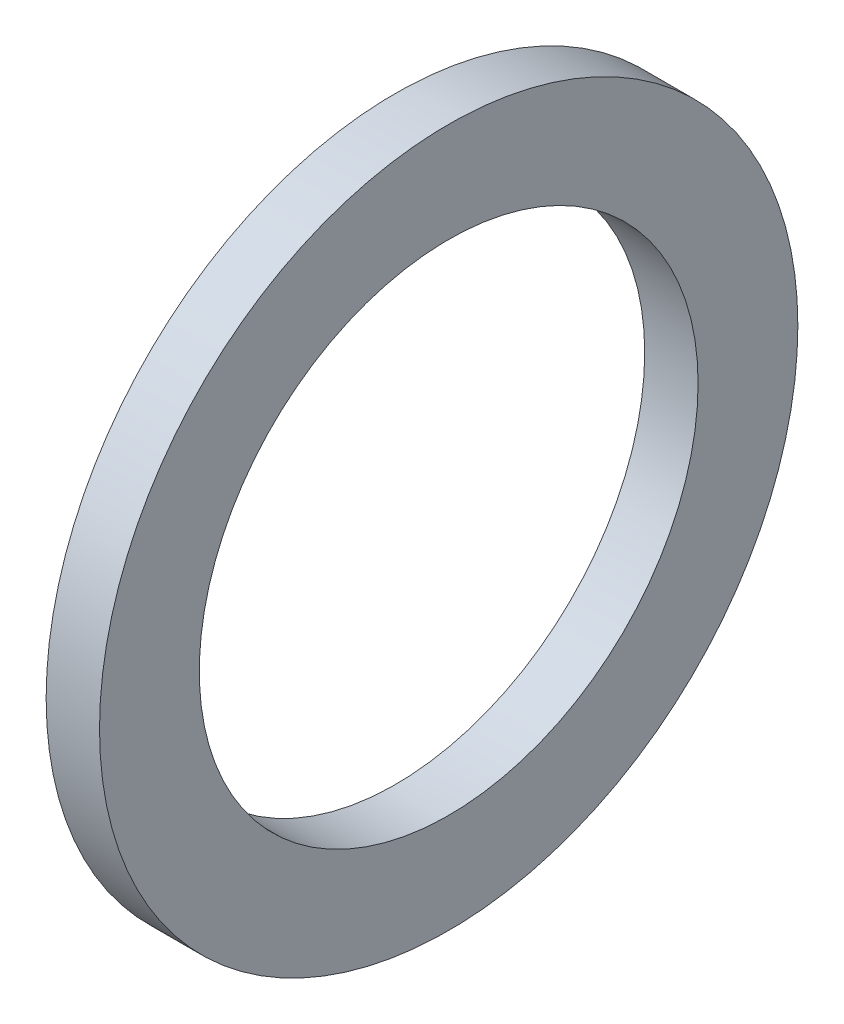
ISO-10303-21;
HEADER;
FILE_DESCRIPTION(('STEP AP214'),'2;1');
FILE_NAME('part.step','',(''),(''),'','','');
FILE_SCHEMA(('AUTOMOTIVE_DESIGN { 1 0 10303 214 1 1 1 1 }'));
ENDSEC;
DATA;
#1=APPLICATION_CONTEXT('core data for automotive mechanical design processes');
#2=APPLICATION_PROTOCOL_DEFINITION('international standard','automotive_design',2000,#1);
#3=PRODUCT_CONTEXT('',#1,'mechanical');
#4=PRODUCT('Part','Part','',(#3));
#5=PRODUCT_RELATED_PRODUCT_CATEGORY('part','',(#4));
#6=PRODUCT_DEFINITION_FORMATION('','',#4);
#7=PRODUCT_DEFINITION_CONTEXT('part definition',#1,'design');
#8=PRODUCT_DEFINITION('design','',#6,#7);
#9=PRODUCT_DEFINITION_SHAPE('','',#8);
#10=(LENGTH_UNIT() NAMED_UNIT(*) SI_UNIT(.MILLI.,.METRE.));
#11=(NAMED_UNIT(*) PLANE_ANGLE_UNIT() SI_UNIT($,.RADIAN.));
#12=(NAMED_UNIT(*) SI_UNIT($,.STERADIAN.) SOLID_ANGLE_UNIT());
#13=UNCERTAINTY_MEASURE_WITH_UNIT(LENGTH_MEASURE(1.E-05),#10,'distance_accuracy_value','');
#14=(GEOMETRIC_REPRESENTATION_CONTEXT(3) GLOBAL_UNCERTAINTY_ASSIGNED_CONTEXT((#13)) GLOBAL_UNIT_ASSIGNED_CONTEXT((#10,
#11,#12)) REPRESENTATION_CONTEXT('',''));
#15=CARTESIAN_POINT('',(0.,0.,0.));
#16=DIRECTION('',(0.,0.,1.));
#17=DIRECTION('',(1.,0.,0.));
#18=AXIS2_PLACEMENT_3D('',#15,#16,#17);
#19=CARTESIAN_POINT('',(1.3589,0.,0.));
#20=DIRECTION('',(1.,0.,0.));
#21=DIRECTION('',(0.,0.,-1.));
#22=AXIS2_PLACEMENT_3D('',#19,#20,#21);
#23=PLANE('',#22);
#24=CARTESIAN_POINT('',(1.3589,0.,0.));
#25=DIRECTION('',(1.,0.,0.));
#26=DIRECTION('',(0.,0.,-1.));
#27=AXIS2_PLACEMENT_3D('',#24,#25,#26);
#28=CIRCLE('',#27,8.89);
#29=CARTESIAN_POINT('',(1.3589,0.,-8.89));
#30=VERTEX_POINT('',#29);
#31=EDGE_CURVE('E10',#30,#30,#28,.T.);
#32=ORIENTED_EDGE('',*,*,#31,.T.);
#33=EDGE_LOOP('',(#32));
#34=FACE_BOUND('',#33,.T.);
#35=CARTESIAN_POINT('',(1.3589,0.,0.));
#36=DIRECTION('',(1.,0.,0.));
#37=DIRECTION('',(0.,0.,-1.));
#38=AXIS2_PLACEMENT_3D('',#35,#36,#37);
#39=CIRCLE('',#38,6.35);
#40=CARTESIAN_POINT('',(1.3589,0.,-6.35));
#41=VERTEX_POINT('',#40);
#42=EDGE_CURVE('E43',#41,#41,#39,.T.);
#43=ORIENTED_EDGE('',*,*,#42,.F.);
#44=EDGE_LOOP('',(#43));
#45=FACE_BOUND('',#44,.T.);
#46=ADVANCED_FACE('F32',(#34,#45),#23,.T.);
#47=CARTESIAN_POINT('',(0.,0.,0.));
#48=DIRECTION('',(1.,0.,0.));
#49=DIRECTION('',(0.,0.,-1.));
#50=AXIS2_PLACEMENT_3D('',#47,#48,#49);
#51=PLANE('',#50);
#52=CARTESIAN_POINT('',(0.,0.,0.));
#53=DIRECTION('',(1.,0.,0.));
#54=DIRECTION('',(0.,0.,-1.));
#55=AXIS2_PLACEMENT_3D('',#52,#53,#54);
#56=CIRCLE('',#55,8.89);
#57=CARTESIAN_POINT('',(0.,0.,-8.89));
#58=VERTEX_POINT('',#57);
#59=EDGE_CURVE('E36',#58,#58,#56,.T.);
#60=ORIENTED_EDGE('',*,*,#59,.F.);
#61=EDGE_LOOP('',(#60));
#62=FACE_BOUND('',#61,.T.);
#63=CARTESIAN_POINT('',(0.,0.,0.));
#64=DIRECTION('',(1.,0.,0.));
#65=DIRECTION('',(0.,0.,-1.));
#66=AXIS2_PLACEMENT_3D('',#63,#64,#65);
#67=CIRCLE('',#66,6.35);
#68=CARTESIAN_POINT('',(0.,0.,-6.35));
#69=VERTEX_POINT('',#68);
#70=EDGE_CURVE('E45',#69,#69,#67,.T.);
#71=ORIENTED_EDGE('',*,*,#70,.T.);
#72=EDGE_LOOP('',(#71));
#73=FACE_BOUND('',#72,.T.);
#74=ADVANCED_FACE('F55',(#62,#73),#51,.F.);
#75=CARTESIAN_POINT('',(1.3589,0.,0.));
#76=DIRECTION('',(-1.,0.,0.));
#77=DIRECTION('',(0.,0.,1.));
#78=AXIS2_PLACEMENT_3D('',#75,#76,#77);
#79=CYLINDRICAL_SURFACE('',#78,8.89);
#80=ORIENTED_EDGE('',*,*,#31,.F.);
#81=EDGE_LOOP('',(#80));
#82=FACE_BOUND('',#81,.T.);
#83=ORIENTED_EDGE('',*,*,#59,.T.);
#84=EDGE_LOOP('',(#83));
#85=FACE_BOUND('',#84,.T.);
#86=ADVANCED_FACE('F34',(#82,#85),#79,.T.);
#87=CARTESIAN_POINT('',(1.3589,0.,0.));
#88=DIRECTION('',(-1.,0.,0.));
#89=DIRECTION('',(0.,0.,1.));
#90=AXIS2_PLACEMENT_3D('',#87,#88,#89);
#91=CYLINDRICAL_SURFACE('',#90,6.35);
#92=ORIENTED_EDGE('',*,*,#42,.T.);
#93=EDGE_LOOP('',(#92));
#94=FACE_BOUND('',#93,.T.);
#95=ORIENTED_EDGE('',*,*,#70,.F.);
#96=EDGE_LOOP('',(#95));
#97=FACE_BOUND('',#96,.T.);
#98=ADVANCED_FACE('F51',(#94,#97),#91,.F.);
#99=CLOSED_SHELL('',(#46,#74,#86,#98));
#100=MANIFOLD_SOLID_BREP('B2',#99);
#101=ADVANCED_BREP_SHAPE_REPRESENTATION('',(#18,#100),#14);
#102=SHAPE_DEFINITION_REPRESENTATION(#9,#101);
ENDSEC;
END-ISO-10303-21;
